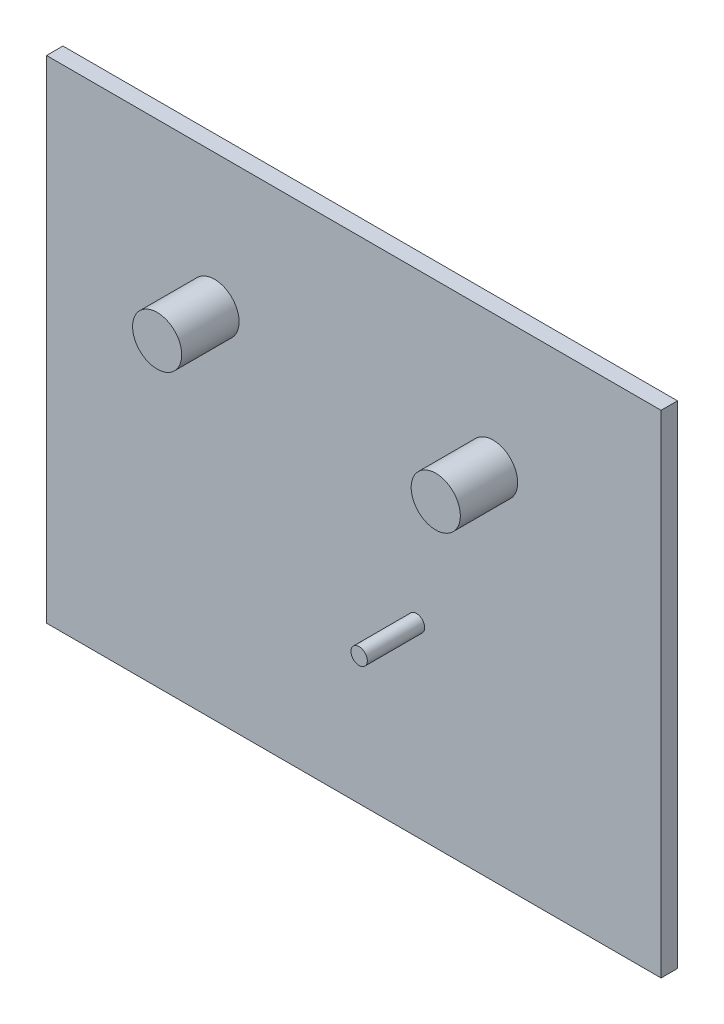
ISO-10303-21;
HEADER;
FILE_DESCRIPTION(('STEP AP214'),'2;1');
FILE_NAME('part.step','',(''),(''),'','','');
FILE_SCHEMA(('AUTOMOTIVE_DESIGN { 1 0 10303 214 1 1 1 1 }'));
ENDSEC;
DATA;
#1=APPLICATION_CONTEXT('core data for automotive mechanical design processes');
#2=APPLICATION_PROTOCOL_DEFINITION('international standard','automotive_design',2000,#1);
#3=PRODUCT_CONTEXT('',#1,'mechanical');
#4=PRODUCT('Part','Part','',(#3));
#5=PRODUCT_RELATED_PRODUCT_CATEGORY('part','',(#4));
#6=PRODUCT_DEFINITION_FORMATION('','',#4);
#7=PRODUCT_DEFINITION_CONTEXT('part definition',#1,'design');
#8=PRODUCT_DEFINITION('design','',#6,#7);
#9=PRODUCT_DEFINITION_SHAPE('','',#8);
#10=(LENGTH_UNIT() NAMED_UNIT(*) SI_UNIT(.MILLI.,.METRE.));
#11=(NAMED_UNIT(*) PLANE_ANGLE_UNIT() SI_UNIT($,.RADIAN.));
#12=(NAMED_UNIT(*) SI_UNIT($,.STERADIAN.) SOLID_ANGLE_UNIT());
#13=UNCERTAINTY_MEASURE_WITH_UNIT(LENGTH_MEASURE(1.E-05),#10,'distance_accuracy_value','');
#14=(GEOMETRIC_REPRESENTATION_CONTEXT(3) GLOBAL_UNCERTAINTY_ASSIGNED_CONTEXT((#13)) GLOBAL_UNIT_ASSIGNED_CONTEXT((#10,
#11,#12)) REPRESENTATION_CONTEXT('',''));
#15=CARTESIAN_POINT('',(0.,0.,0.));
#16=DIRECTION('',(0.,0.,1.));
#17=DIRECTION('',(1.,0.,0.));
#18=AXIS2_PLACEMENT_3D('',#15,#16,#17);
#19=CARTESIAN_POINT('',(0.,0.,2.));
#20=DIRECTION('',(0.,0.,1.));
#21=DIRECTION('',(1.,0.,0.));
#22=AXIS2_PLACEMENT_3D('',#19,#20,#21);
#23=PLANE('',#22);
#24=CARTESIAN_POINT('',(17.,13.6,2.));
#25=DIRECTION('',(0.,0.,1.));
#26=DIRECTION('',(1.,0.,0.));
#27=AXIS2_PLACEMENT_3D('',#24,#25,#26);
#28=CIRCLE('',#27,3.);
#29=CARTESIAN_POINT('',(20.,13.6,2.));
#30=VERTEX_POINT('',#29);
#31=EDGE_CURVE('E115',#30,#30,#28,.T.);
#32=ORIENTED_EDGE('',*,*,#31,.F.);
#33=EDGE_LOOP('',(#32));
#34=FACE_BOUND('',#33,.T.);
#35=DIRECTION('',(1.,0.,0.));
#36=VECTOR('',#35,1.);
#37=CARTESIAN_POINT('',(-37.5,-30.,2.));
#38=LINE('',#37,#36);
#39=CARTESIAN_POINT('',(-37.5,-30.,2.));
#40=VERTEX_POINT('',#39);
#41=CARTESIAN_POINT('',(37.5,-30.,2.));
#42=VERTEX_POINT('',#41);
#43=EDGE_CURVE('E83',#40,#42,#38,.T.);
#44=ORIENTED_EDGE('',*,*,#43,.T.);
#45=DIRECTION('',(0.,1.,0.));
#46=VECTOR('',#45,1.);
#47=CARTESIAN_POINT('',(37.5,-30.,2.));
#48=LINE('',#47,#46);
#49=CARTESIAN_POINT('',(37.5,30.,2.));
#50=VERTEX_POINT('',#49);
#51=EDGE_CURVE('E75',#42,#50,#48,.T.);
#52=ORIENTED_EDGE('',*,*,#51,.T.);
#53=DIRECTION('',(1.,0.,0.));
#54=VECTOR('',#53,1.);
#55=CARTESIAN_POINT('',(-37.5,30.,2.));
#56=LINE('',#55,#54);
#57=CARTESIAN_POINT('',(-37.5,30.,2.));
#58=VERTEX_POINT('',#57);
#59=EDGE_CURVE('E82',#58,#50,#56,.T.);
#60=ORIENTED_EDGE('',*,*,#59,.F.);
#61=DIRECTION('',(0.,1.,0.));
#62=VECTOR('',#61,1.);
#63=CARTESIAN_POINT('',(-37.5,-30.,2.));
#64=LINE('',#63,#62);
#65=EDGE_CURVE('E92',#40,#58,#64,.T.);
#66=ORIENTED_EDGE('',*,*,#65,.F.);
#67=EDGE_LOOP('',(#44,#52,#60,#66));
#68=FACE_BOUND('',#67,.T.);
#69=CARTESIAN_POINT('',(-17.,13.6,2.));
#70=DIRECTION('',(0.,0.,1.));
#71=DIRECTION('',(1.,0.,0.));
#72=AXIS2_PLACEMENT_3D('',#69,#70,#71);
#73=CIRCLE('',#72,3.);
#74=CARTESIAN_POINT('',(-14.,13.6,2.));
#75=VERTEX_POINT('',#74);
#76=EDGE_CURVE('E109',#75,#75,#73,.T.);
#77=ORIENTED_EDGE('',*,*,#76,.F.);
#78=EDGE_LOOP('',(#77));
#79=FACE_BOUND('',#78,.T.);
#80=CARTESIAN_POINT('',(7.64921894064177,-7.4,2.));
#81=DIRECTION('',(0.,0.,1.));
#82=DIRECTION('',(1.,0.,0.));
#83=AXIS2_PLACEMENT_3D('',#80,#81,#82);
#84=CIRCLE('',#83,1.);
#85=CARTESIAN_POINT('',(8.64921894064177,-7.4,2.));
#86=VERTEX_POINT('',#85);
#87=EDGE_CURVE('E121',#86,#86,#84,.T.);
#88=ORIENTED_EDGE('',*,*,#87,.F.);
#89=EDGE_LOOP('',(#88));
#90=FACE_BOUND('',#89,.T.);
#91=ADVANCED_FACE('F33',(#34,#68,#79,#90),#23,.T.);
#92=CARTESIAN_POINT('',(-37.5,-30.,2.));
#93=DIRECTION('',(0.,1.,0.));
#94=DIRECTION('',(0.,0.,1.));
#95=AXIS2_PLACEMENT_3D('',#92,#93,#94);
#96=PLANE('',#95);
#97=DIRECTION('',(1.,0.,0.));
#98=VECTOR('',#97,1.);
#99=CARTESIAN_POINT('',(-37.5,-30.,0.));
#100=LINE('',#99,#98);
#101=CARTESIAN_POINT('',(-37.5,-30.,0.));
#102=VERTEX_POINT('',#101);
#103=CARTESIAN_POINT('',(37.5,-30.,0.));
#104=VERTEX_POINT('',#103);
#105=EDGE_CURVE('E97',#102,#104,#100,.T.);
#106=ORIENTED_EDGE('',*,*,#105,.T.);
#107=DIRECTION('',(0.,0.,-1.));
#108=VECTOR('',#107,1.);
#109=CARTESIAN_POINT('',(37.5,-30.,2.));
#110=LINE('',#109,#108);
#111=EDGE_CURVE('E11',#42,#104,#110,.T.);
#112=ORIENTED_EDGE('',*,*,#111,.F.);
#113=ORIENTED_EDGE('',*,*,#43,.F.);
#114=DIRECTION('',(0.,0.,-1.));
#115=VECTOR('',#114,1.);
#116=CARTESIAN_POINT('',(-37.5,-30.,2.));
#117=LINE('',#116,#115);
#118=EDGE_CURVE('E50',#40,#102,#117,.T.);
#119=ORIENTED_EDGE('',*,*,#118,.T.);
#120=EDGE_LOOP('',(#106,#112,#113,#119));
#121=FACE_BOUND('',#120,.T.);
#122=ADVANCED_FACE('F35',(#121),#96,.F.);
#123=CARTESIAN_POINT('',(37.5,-30.,2.));
#124=DIRECTION('',(-1.,0.,0.));
#125=DIRECTION('',(0.,0.,1.));
#126=AXIS2_PLACEMENT_3D('',#123,#124,#125);
#127=PLANE('',#126);
#128=DIRECTION('',(0.,1.,0.));
#129=VECTOR('',#128,1.);
#130=CARTESIAN_POINT('',(37.5,-30.,0.));
#131=LINE('',#130,#129);
#132=CARTESIAN_POINT('',(37.5,30.,0.));
#133=VERTEX_POINT('',#132);
#134=EDGE_CURVE('E88',#104,#133,#131,.T.);
#135=ORIENTED_EDGE('',*,*,#134,.T.);
#136=DIRECTION('',(0.,0.,-1.));
#137=VECTOR('',#136,1.);
#138=CARTESIAN_POINT('',(37.5,30.,2.));
#139=LINE('',#138,#137);
#140=EDGE_CURVE('E42',#50,#133,#139,.T.);
#141=ORIENTED_EDGE('',*,*,#140,.F.);
#142=ORIENTED_EDGE('',*,*,#51,.F.);
#143=ORIENTED_EDGE('',*,*,#111,.T.);
#144=EDGE_LOOP('',(#135,#141,#142,#143));
#145=FACE_BOUND('',#144,.T.);
#146=ADVANCED_FACE('F87',(#145),#127,.F.);
#147=CARTESIAN_POINT('',(-37.5,30.,2.));
#148=DIRECTION('',(0.,1.,0.));
#149=DIRECTION('',(0.,0.,1.));
#150=AXIS2_PLACEMENT_3D('',#147,#148,#149);
#151=PLANE('',#150);
#152=DIRECTION('',(1.,0.,0.));
#153=VECTOR('',#152,1.);
#154=CARTESIAN_POINT('',(-37.5,30.,0.));
#155=LINE('',#154,#153);
#156=CARTESIAN_POINT('',(-37.5,30.,0.));
#157=VERTEX_POINT('',#156);
#158=EDGE_CURVE('E101',#157,#133,#155,.T.);
#159=ORIENTED_EDGE('',*,*,#158,.F.);
#160=DIRECTION('',(0.,0.,-1.));
#161=VECTOR('',#160,1.);
#162=CARTESIAN_POINT('',(-37.5,30.,2.));
#163=LINE('',#162,#161);
#164=EDGE_CURVE('E64',#58,#157,#163,.T.);
#165=ORIENTED_EDGE('',*,*,#164,.F.);
#166=ORIENTED_EDGE('',*,*,#59,.T.);
#167=ORIENTED_EDGE('',*,*,#140,.T.);
#168=EDGE_LOOP('',(#159,#165,#166,#167));
#169=FACE_BOUND('',#168,.T.);
#170=ADVANCED_FACE('F91',(#169),#151,.T.);
#171=CARTESIAN_POINT('',(-37.5,-30.,2.));
#172=DIRECTION('',(-1.,0.,0.));
#173=DIRECTION('',(0.,0.,1.));
#174=AXIS2_PLACEMENT_3D('',#171,#172,#173);
#175=PLANE('',#174);
#176=DIRECTION('',(0.,1.,0.));
#177=VECTOR('',#176,1.);
#178=CARTESIAN_POINT('',(-37.5,-30.,0.));
#179=LINE('',#178,#177);
#180=EDGE_CURVE('E103',#102,#157,#179,.T.);
#181=ORIENTED_EDGE('',*,*,#180,.F.);
#182=ORIENTED_EDGE('',*,*,#118,.F.);
#183=ORIENTED_EDGE('',*,*,#65,.T.);
#184=ORIENTED_EDGE('',*,*,#164,.T.);
#185=EDGE_LOOP('',(#181,#182,#183,#184));
#186=FACE_BOUND('',#185,.T.);
#187=ADVANCED_FACE('F150',(#186),#175,.T.);
#188=CARTESIAN_POINT('',(0.,0.,0.));
#189=DIRECTION('',(0.,0.,1.));
#190=DIRECTION('',(1.,0.,0.));
#191=AXIS2_PLACEMENT_3D('',#188,#189,#190);
#192=PLANE('',#191);
#193=ORIENTED_EDGE('',*,*,#105,.F.);
#194=ORIENTED_EDGE('',*,*,#180,.T.);
#195=ORIENTED_EDGE('',*,*,#158,.T.);
#196=ORIENTED_EDGE('',*,*,#134,.F.);
#197=EDGE_LOOP('',(#193,#194,#195,#196));
#198=FACE_BOUND('',#197,.T.);
#199=ADVANCED_FACE('F147',(#198),#192,.F.);
#200=CARTESIAN_POINT('',(-17.,13.6,9.));
#201=DIRECTION('',(0.,0.,-1.));
#202=DIRECTION('',(-1.,0.,0.));
#203=AXIS2_PLACEMENT_3D('',#200,#201,#202);
#204=CYLINDRICAL_SURFACE('',#203,3.);
#205=CARTESIAN_POINT('',(-17.,13.6,9.));
#206=DIRECTION('',(0.,0.,1.));
#207=DIRECTION('',(1.,0.,0.));
#208=AXIS2_PLACEMENT_3D('',#205,#206,#207);
#209=CIRCLE('',#208,3.);
#210=CARTESIAN_POINT('',(-14.,13.6,9.));
#211=VERTEX_POINT('',#210);
#212=EDGE_CURVE('E99',#211,#211,#209,.T.);
#213=ORIENTED_EDGE('',*,*,#212,.F.);
#214=EDGE_LOOP('',(#213));
#215=FACE_BOUND('',#214,.T.);
#216=ORIENTED_EDGE('',*,*,#76,.T.);
#217=EDGE_LOOP('',(#216));
#218=FACE_BOUND('',#217,.T.);
#219=ADVANCED_FACE('F145',(#215,#218),#204,.T.);
#220=CARTESIAN_POINT('',(-17.,13.6,9.));
#221=DIRECTION('',(0.,0.,1.));
#222=DIRECTION('',(1.,0.,0.));
#223=AXIS2_PLACEMENT_3D('',#220,#221,#222);
#224=PLANE('',#223);
#225=ORIENTED_EDGE('',*,*,#212,.T.);
#226=EDGE_LOOP('',(#225));
#227=FACE_BOUND('',#226,.T.);
#228=ADVANCED_FACE('F177',(#227),#224,.T.);
#229=CARTESIAN_POINT('',(17.,13.6,9.));
#230=DIRECTION('',(0.,0.,-1.));
#231=DIRECTION('',(-1.,0.,0.));
#232=AXIS2_PLACEMENT_3D('',#229,#230,#231);
#233=CYLINDRICAL_SURFACE('',#232,3.);
#234=CARTESIAN_POINT('',(17.,13.6,9.));
#235=DIRECTION('',(0.,0.,1.));
#236=DIRECTION('',(1.,0.,0.));
#237=AXIS2_PLACEMENT_3D('',#234,#235,#236);
#238=CIRCLE('',#237,3.);
#239=CARTESIAN_POINT('',(20.,13.6,9.));
#240=VERTEX_POINT('',#239);
#241=EDGE_CURVE('E112',#240,#240,#238,.T.);
#242=ORIENTED_EDGE('',*,*,#241,.F.);
#243=EDGE_LOOP('',(#242));
#244=FACE_BOUND('',#243,.T.);
#245=ORIENTED_EDGE('',*,*,#31,.T.);
#246=EDGE_LOOP('',(#245));
#247=FACE_BOUND('',#246,.T.);
#248=ADVANCED_FACE('F184',(#244,#247),#233,.T.);
#249=CARTESIAN_POINT('',(17.,13.6,9.));
#250=DIRECTION('',(0.,0.,1.));
#251=DIRECTION('',(1.,0.,0.));
#252=AXIS2_PLACEMENT_3D('',#249,#250,#251);
#253=PLANE('',#252);
#254=ORIENTED_EDGE('',*,*,#241,.T.);
#255=EDGE_LOOP('',(#254));
#256=FACE_BOUND('',#255,.T.);
#257=ADVANCED_FACE('F132',(#256),#253,.T.);
#258=CARTESIAN_POINT('',(7.64921894064177,-7.4,9.));
#259=DIRECTION('',(0.,0.,-1.));
#260=DIRECTION('',(-1.,0.,0.));
#261=AXIS2_PLACEMENT_3D('',#258,#259,#260);
#262=CYLINDRICAL_SURFACE('',#261,1.);
#263=CARTESIAN_POINT('',(7.64921894064177,-7.4,9.));
#264=DIRECTION('',(0.,0.,1.));
#265=DIRECTION('',(1.,0.,0.));
#266=AXIS2_PLACEMENT_3D('',#263,#264,#265);
#267=CIRCLE('',#266,1.);
#268=CARTESIAN_POINT('',(8.64921894064177,-7.4,9.));
#269=VERTEX_POINT('',#268);
#270=EDGE_CURVE('E118',#269,#269,#267,.T.);
#271=ORIENTED_EDGE('',*,*,#270,.F.);
#272=EDGE_LOOP('',(#271));
#273=FACE_BOUND('',#272,.T.);
#274=ORIENTED_EDGE('',*,*,#87,.T.);
#275=EDGE_LOOP('',(#274));
#276=FACE_BOUND('',#275,.T.);
#277=ADVANCED_FACE('F129',(#273,#276),#262,.T.);
#278=CARTESIAN_POINT('',(7.64921894064177,-7.4,9.));
#279=DIRECTION('',(0.,0.,1.));
#280=DIRECTION('',(1.,0.,0.));
#281=AXIS2_PLACEMENT_3D('',#278,#279,#280);
#282=PLANE('',#281);
#283=ORIENTED_EDGE('',*,*,#270,.T.);
#284=EDGE_LOOP('',(#283));
#285=FACE_BOUND('',#284,.T.);
#286=ADVANCED_FACE('F127',(#285),#282,.T.);
#287=CLOSED_SHELL('',(#91,#122,#146,#170,#187,#199,#219,#228,#248,#257,#277,#286));
#288=MANIFOLD_SOLID_BREP('B2',#287);
#289=ADVANCED_BREP_SHAPE_REPRESENTATION('',(#18,#288),#14);
#290=SHAPE_DEFINITION_REPRESENTATION(#9,#289);
ENDSEC;
END-ISO-10303-21;
